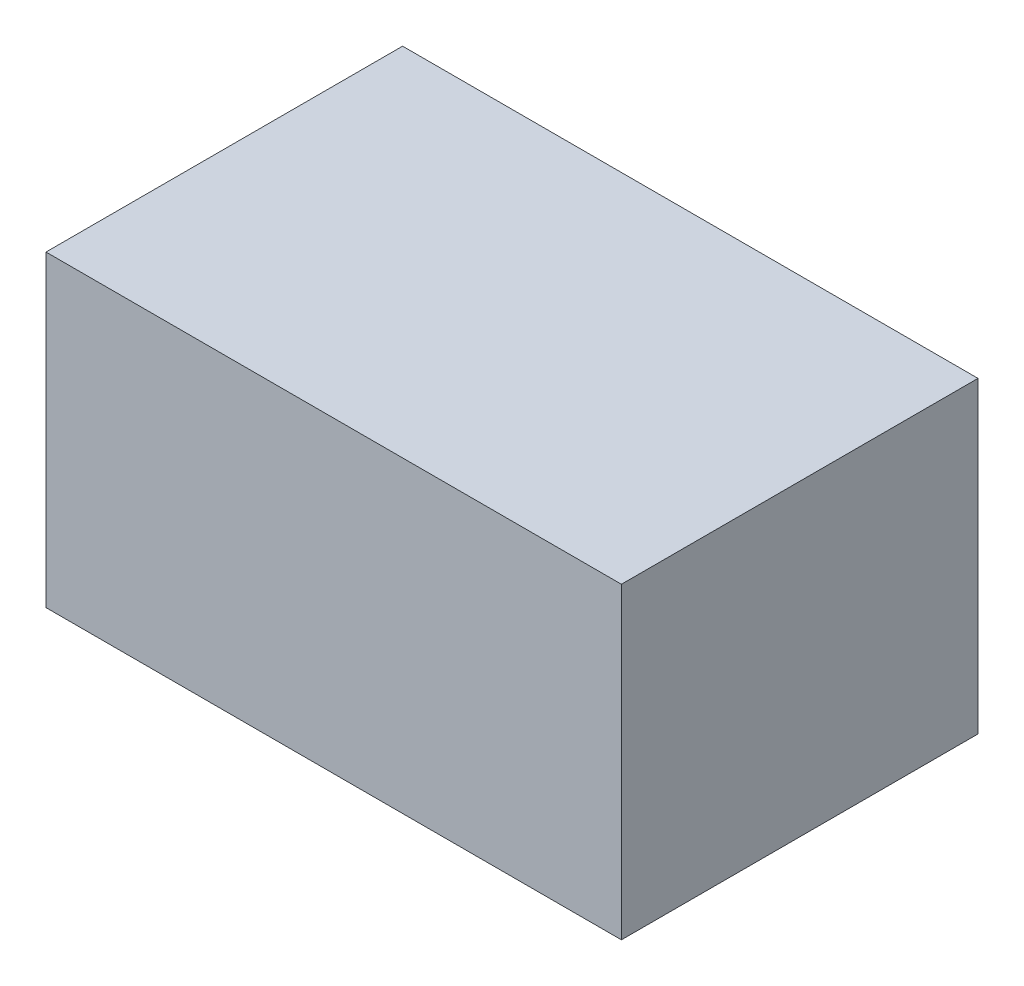
ISO-10303-21;
HEADER;
FILE_DESCRIPTION(('STEP AP214'),'2;1');
FILE_NAME('part.step','',(''),(''),'','','');
FILE_SCHEMA(('AUTOMOTIVE_DESIGN { 1 0 10303 214 1 1 1 1 }'));
ENDSEC;
DATA;
#1=APPLICATION_CONTEXT('core data for automotive mechanical design processes');
#2=APPLICATION_PROTOCOL_DEFINITION('international standard','automotive_design',2000,#1);
#3=PRODUCT_CONTEXT('',#1,'mechanical');
#4=PRODUCT('Part','Part','',(#3));
#5=PRODUCT_RELATED_PRODUCT_CATEGORY('part','',(#4));
#6=PRODUCT_DEFINITION_FORMATION('','',#4);
#7=PRODUCT_DEFINITION_CONTEXT('part definition',#1,'design');
#8=PRODUCT_DEFINITION('design','',#6,#7);
#9=PRODUCT_DEFINITION_SHAPE('','',#8);
#10=(LENGTH_UNIT() NAMED_UNIT(*) SI_UNIT(.MILLI.,.METRE.));
#11=(NAMED_UNIT(*) PLANE_ANGLE_UNIT() SI_UNIT($,.RADIAN.));
#12=(NAMED_UNIT(*) SI_UNIT($,.STERADIAN.) SOLID_ANGLE_UNIT());
#13=UNCERTAINTY_MEASURE_WITH_UNIT(LENGTH_MEASURE(1.E-05),#10,'distance_accuracy_value','');
#14=(GEOMETRIC_REPRESENTATION_CONTEXT(3) GLOBAL_UNCERTAINTY_ASSIGNED_CONTEXT((#13)) GLOBAL_UNIT_ASSIGNED_CONTEXT((#10,
#11,#12)) REPRESENTATION_CONTEXT('',''));
#15=CARTESIAN_POINT('',(0.,0.,0.));
#16=DIRECTION('',(0.,0.,1.));
#17=DIRECTION('',(1.,0.,0.));
#18=AXIS2_PLACEMENT_3D('',#15,#16,#17);
#19=CARTESIAN_POINT('',(355.,380.,-220.));
#20=DIRECTION('',(-1.,0.,0.));
#21=DIRECTION('',(0.,0.,1.));
#22=AXIS2_PLACEMENT_3D('',#19,#20,#21);
#23=PLANE('',#22);
#24=DIRECTION('',(0.,0.,-1.));
#25=VECTOR('',#24,1.);
#26=CARTESIAN_POINT('',(355.,0.,-220.));
#27=LINE('',#26,#25);
#28=CARTESIAN_POINT('',(355.,0.,220.));
#29=VERTEX_POINT('',#28);
#30=CARTESIAN_POINT('',(355.,0.,-220.));
#31=VERTEX_POINT('',#30);
#32=EDGE_CURVE('E96',#29,#31,#27,.T.);
#33=ORIENTED_EDGE('',*,*,#32,.T.);
#34=DIRECTION('',(0.,-1.,0.));
#35=VECTOR('',#34,1.);
#36=CARTESIAN_POINT('',(355.,380.,-220.));
#37=LINE('',#36,#35);
#38=CARTESIAN_POINT('',(355.,380.,-220.));
#39=VERTEX_POINT('',#38);
#40=EDGE_CURVE('E11',#39,#31,#37,.T.);
#41=ORIENTED_EDGE('',*,*,#40,.F.);
#42=DIRECTION('',(0.,0.,-1.));
#43=VECTOR('',#42,1.);
#44=CARTESIAN_POINT('',(355.,380.,-220.));
#45=LINE('',#44,#43);
#46=CARTESIAN_POINT('',(355.,380.,220.));
#47=VERTEX_POINT('',#46);
#48=EDGE_CURVE('E84',#47,#39,#45,.T.);
#49=ORIENTED_EDGE('',*,*,#48,.F.);
#50=DIRECTION('',(0.,-1.,0.));
#51=VECTOR('',#50,1.);
#52=CARTESIAN_POINT('',(355.,380.,220.));
#53=LINE('',#52,#51);
#54=EDGE_CURVE('E92',#47,#29,#53,.T.);
#55=ORIENTED_EDGE('',*,*,#54,.T.);
#56=EDGE_LOOP('',(#33,#41,#49,#55));
#57=FACE_BOUND('',#56,.T.);
#58=ADVANCED_FACE('F33',(#57),#23,.F.);
#59=CARTESIAN_POINT('',(-355.,380.,-220.));
#60=DIRECTION('',(0.,0.,1.));
#61=DIRECTION('',(1.,0.,0.));
#62=AXIS2_PLACEMENT_3D('',#59,#60,#61);
#63=PLANE('',#62);
#64=DIRECTION('',(-1.,0.,0.));
#65=VECTOR('',#64,1.);
#66=CARTESIAN_POINT('',(-355.,0.,-220.));
#67=LINE('',#66,#65);
#68=CARTESIAN_POINT('',(-355.,0.,-220.));
#69=VERTEX_POINT('',#68);
#70=EDGE_CURVE('E88',#31,#69,#67,.T.);
#71=ORIENTED_EDGE('',*,*,#70,.T.);
#72=DIRECTION('',(0.,-1.,0.));
#73=VECTOR('',#72,1.);
#74=CARTESIAN_POINT('',(-355.,380.,-220.));
#75=LINE('',#74,#73);
#76=CARTESIAN_POINT('',(-355.,380.,-220.));
#77=VERTEX_POINT('',#76);
#78=EDGE_CURVE('E41',#77,#69,#75,.T.);
#79=ORIENTED_EDGE('',*,*,#78,.F.);
#80=DIRECTION('',(-1.,0.,0.));
#81=VECTOR('',#80,1.);
#82=CARTESIAN_POINT('',(-355.,380.,-220.));
#83=LINE('',#82,#81);
#84=EDGE_CURVE('E79',#39,#77,#83,.T.);
#85=ORIENTED_EDGE('',*,*,#84,.F.);
#86=ORIENTED_EDGE('',*,*,#40,.T.);
#87=EDGE_LOOP('',(#71,#79,#85,#86));
#88=FACE_BOUND('',#87,.T.);
#89=ADVANCED_FACE('F87',(#88),#63,.F.);
#90=CARTESIAN_POINT('',(-355.,380.,-220.));
#91=DIRECTION('',(1.,0.,0.));
#92=DIRECTION('',(0.,0.,-1.));
#93=AXIS2_PLACEMENT_3D('',#90,#91,#92);
#94=PLANE('',#93);
#95=DIRECTION('',(0.,0.,1.));
#96=VECTOR('',#95,1.);
#97=CARTESIAN_POINT('',(-355.,0.,-220.));
#98=LINE('',#97,#96);
#99=CARTESIAN_POINT('',(-355.,0.,220.));
#100=VERTEX_POINT('',#99);
#101=EDGE_CURVE('E66',#69,#100,#98,.T.);
#102=ORIENTED_EDGE('',*,*,#101,.T.);
#103=DIRECTION('',(0.,-1.,0.));
#104=VECTOR('',#103,1.);
#105=CARTESIAN_POINT('',(-355.,380.,220.));
#106=LINE('',#105,#104);
#107=CARTESIAN_POINT('',(-355.,380.,220.));
#108=VERTEX_POINT('',#107);
#109=EDGE_CURVE('E89',#108,#100,#106,.T.);
#110=ORIENTED_EDGE('',*,*,#109,.F.);
#111=DIRECTION('',(0.,0.,1.));
#112=VECTOR('',#111,1.);
#113=CARTESIAN_POINT('',(-355.,380.,-220.));
#114=LINE('',#113,#112);
#115=EDGE_CURVE('E82',#77,#108,#114,.T.);
#116=ORIENTED_EDGE('',*,*,#115,.F.);
#117=ORIENTED_EDGE('',*,*,#78,.T.);
#118=EDGE_LOOP('',(#102,#110,#116,#117));
#119=FACE_BOUND('',#118,.T.);
#120=ADVANCED_FACE('F90',(#119),#94,.F.);
#121=CARTESIAN_POINT('',(-355.,380.,220.));
#122=DIRECTION('',(0.,0.,-1.));
#123=DIRECTION('',(-1.,0.,0.));
#124=AXIS2_PLACEMENT_3D('',#121,#122,#123);
#125=PLANE('',#124);
#126=DIRECTION('',(1.,0.,0.));
#127=VECTOR('',#126,1.);
#128=CARTESIAN_POINT('',(-355.,0.,220.));
#129=LINE('',#128,#127);
#130=EDGE_CURVE('E72',#100,#29,#129,.T.);
#131=ORIENTED_EDGE('',*,*,#130,.T.);
#132=ORIENTED_EDGE('',*,*,#54,.F.);
#133=DIRECTION('',(1.,0.,0.));
#134=VECTOR('',#133,1.);
#135=CARTESIAN_POINT('',(-355.,380.,220.));
#136=LINE('',#135,#134);
#137=EDGE_CURVE('E49',#108,#47,#136,.T.);
#138=ORIENTED_EDGE('',*,*,#137,.F.);
#139=ORIENTED_EDGE('',*,*,#109,.T.);
#140=EDGE_LOOP('',(#131,#132,#138,#139));
#141=FACE_BOUND('',#140,.T.);
#142=ADVANCED_FACE('F103',(#141),#125,.F.);
#143=CARTESIAN_POINT('',(0.,380.,0.));
#144=DIRECTION('',(0.,1.,0.));
#145=DIRECTION('',(0.,0.,1.));
#146=AXIS2_PLACEMENT_3D('',#143,#144,#145);
#147=PLANE('',#146);
#148=ORIENTED_EDGE('',*,*,#48,.T.);
#149=ORIENTED_EDGE('',*,*,#84,.T.);
#150=ORIENTED_EDGE('',*,*,#115,.T.);
#151=ORIENTED_EDGE('',*,*,#137,.T.);
#152=EDGE_LOOP('',(#148,#149,#150,#151));
#153=FACE_BOUND('',#152,.T.);
#154=ADVANCED_FACE('F80',(#153),#147,.T.);
#155=CARTESIAN_POINT('',(0.,0.,0.));
#156=DIRECTION('',(0.,1.,0.));
#157=DIRECTION('',(0.,0.,1.));
#158=AXIS2_PLACEMENT_3D('',#155,#156,#157);
#159=PLANE('',#158);
#160=ORIENTED_EDGE('',*,*,#32,.F.);
#161=ORIENTED_EDGE('',*,*,#130,.F.);
#162=ORIENTED_EDGE('',*,*,#101,.F.);
#163=ORIENTED_EDGE('',*,*,#70,.F.);
#164=EDGE_LOOP('',(#160,#161,#162,#163));
#165=FACE_BOUND('',#164,.T.);
#166=ADVANCED_FACE('F106',(#165),#159,.F.);
#167=CLOSED_SHELL('',(#58,#89,#120,#142,#154,#166));
#168=MANIFOLD_SOLID_BREP('B2',#167);
#169=ADVANCED_BREP_SHAPE_REPRESENTATION('',(#18,#168),#14);
#170=SHAPE_DEFINITION_REPRESENTATION(#9,#169);
ENDSEC;
END-ISO-10303-21;
